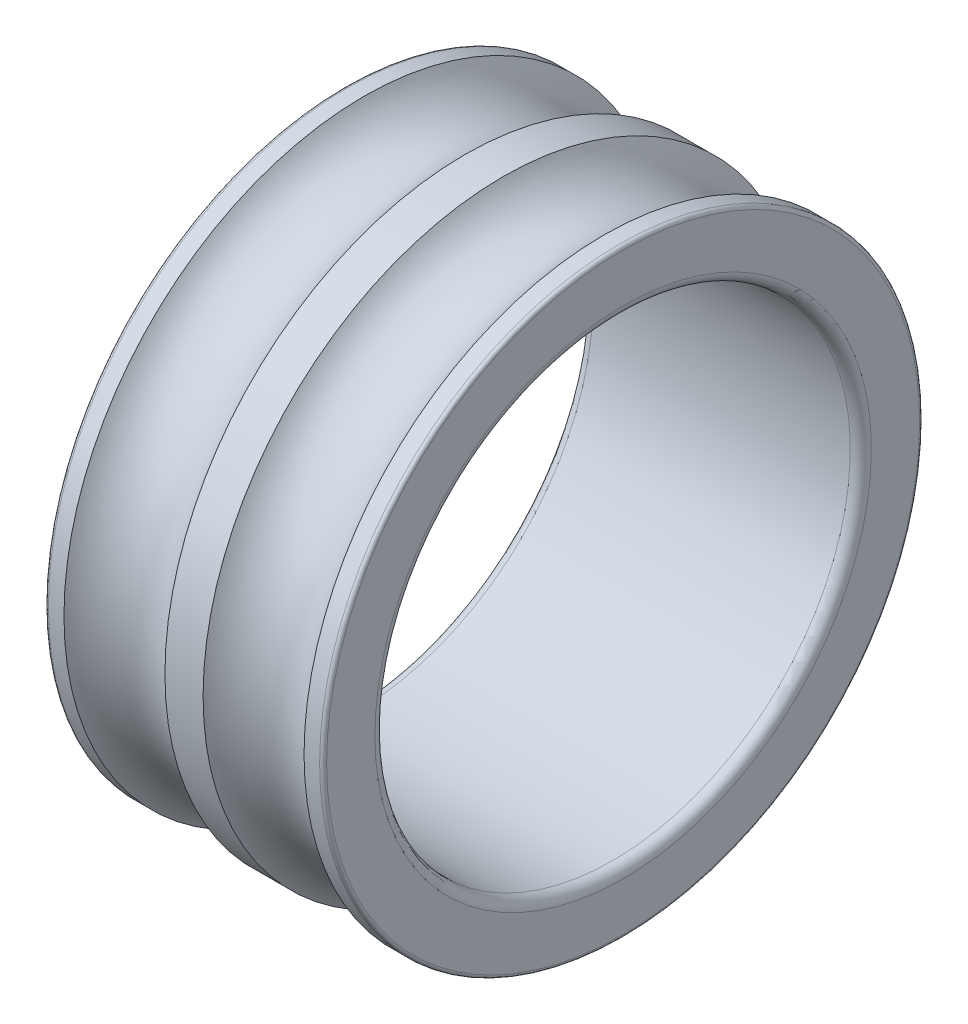
ISO-10303-21;
HEADER;
FILE_DESCRIPTION(('STEP AP214'),'2;1');
FILE_NAME('part.step','',(''),(''),'','','');
FILE_SCHEMA(('AUTOMOTIVE_DESIGN { 1 0 10303 214 1 1 1 1 }'));
ENDSEC;
DATA;
#1=APPLICATION_CONTEXT('core data for automotive mechanical design processes');
#2=APPLICATION_PROTOCOL_DEFINITION('international standard','automotive_design',2000,#1);
#3=PRODUCT_CONTEXT('',#1,'mechanical');
#4=PRODUCT('Part','Part','',(#3));
#5=PRODUCT_RELATED_PRODUCT_CATEGORY('part','',(#4));
#6=PRODUCT_DEFINITION_FORMATION('','',#4);
#7=PRODUCT_DEFINITION_CONTEXT('part definition',#1,'design');
#8=PRODUCT_DEFINITION('design','',#6,#7);
#9=PRODUCT_DEFINITION_SHAPE('','',#8);
#10=(LENGTH_UNIT() NAMED_UNIT(*) SI_UNIT(.MILLI.,.METRE.));
#11=(NAMED_UNIT(*) PLANE_ANGLE_UNIT() SI_UNIT($,.RADIAN.));
#12=(NAMED_UNIT(*) SI_UNIT($,.STERADIAN.) SOLID_ANGLE_UNIT());
#13=UNCERTAINTY_MEASURE_WITH_UNIT(LENGTH_MEASURE(1.E-05),#10,'distance_accuracy_value','');
#14=(GEOMETRIC_REPRESENTATION_CONTEXT(3) GLOBAL_UNCERTAINTY_ASSIGNED_CONTEXT((#13)) GLOBAL_UNIT_ASSIGNED_CONTEXT((#10,
#11,#12)) REPRESENTATION_CONTEXT('',''));
#15=CARTESIAN_POINT('',(0.,0.,0.));
#16=DIRECTION('',(0.,0.,1.));
#17=DIRECTION('',(1.,0.,0.));
#18=AXIS2_PLACEMENT_3D('',#15,#16,#17);
#19=CARTESIAN_POINT('',(2.09999999999957,0.,0.));
#20=DIRECTION('',(-1.,0.,0.));
#21=DIRECTION('',(0.,0.,1.));
#22=AXIS2_PLACEMENT_3D('',#19,#20,#21);
#23=TOROIDAL_SURFACE('',#22,49.5999999999996,2.09999999999957);
#24=CARTESIAN_POINT('',(2.1,0.,0.));
#25=DIRECTION('',(-1.,0.,0.));
#26=DIRECTION('',(0.,0.,1.));
#27=AXIS2_PLACEMENT_3D('',#24,#25,#26);
#28=CIRCLE('',#27,47.5);
#29=CARTESIAN_POINT('',(2.1,0.,47.5));
#30=VERTEX_POINT('',#29);
#31=EDGE_CURVE('E10',#30,#30,#28,.T.);
#32=ORIENTED_EDGE('',*,*,#31,.F.);
#33=EDGE_LOOP('',(#32));
#34=FACE_BOUND('',#33,.T.);
#35=CARTESIAN_POINT('',(0.,0.,0.));
#36=DIRECTION('',(-1.,0.,0.));
#37=DIRECTION('',(0.,0.,1.));
#38=AXIS2_PLACEMENT_3D('',#35,#36,#37);
#39=CIRCLE('',#38,49.6);
#40=CARTESIAN_POINT('',(0.,0.,49.6));
#41=VERTEX_POINT('',#40);
#42=EDGE_CURVE('E71',#41,#41,#39,.T.);
#43=ORIENTED_EDGE('',*,*,#42,.T.);
#44=EDGE_LOOP('',(#43));
#45=FACE_BOUND('',#44,.T.);
#46=ADVANCED_FACE('F31',(#34,#45),#23,.T.);
#47=CARTESIAN_POINT('',(55.6,0.,0.));
#48=DIRECTION('',(-1.,0.,0.));
#49=DIRECTION('',(0.,0.,1.));
#50=AXIS2_PLACEMENT_3D('',#47,#48,#49);
#51=CYLINDRICAL_SURFACE('',#50,47.5);
#52=CARTESIAN_POINT('',(53.5,0.,0.));
#53=DIRECTION('',(-1.,0.,0.));
#54=DIRECTION('',(0.,0.,1.));
#55=AXIS2_PLACEMENT_3D('',#52,#53,#54);
#56=CIRCLE('',#55,47.5);
#57=CARTESIAN_POINT('',(53.5,0.,47.5));
#58=VERTEX_POINT('',#57);
#59=EDGE_CURVE('E37',#58,#58,#56,.T.);
#60=ORIENTED_EDGE('',*,*,#59,.F.);
#61=EDGE_LOOP('',(#60));
#62=FACE_BOUND('',#61,.T.);
#63=ORIENTED_EDGE('',*,*,#31,.T.);
#64=EDGE_LOOP('',(#63));
#65=FACE_BOUND('',#64,.T.);
#66=ADVANCED_FACE('F132',(#62,#65),#51,.F.);
#67=CARTESIAN_POINT('',(53.5000000000009,0.,0.));
#68=DIRECTION('',(-1.,0.,0.));
#69=DIRECTION('',(0.,0.,1.));
#70=AXIS2_PLACEMENT_3D('',#67,#68,#69);
#71=TOROIDAL_SURFACE('',#70,49.5999999999991,2.09999999999914);
#72=CARTESIAN_POINT('',(55.6,0.,0.));
#73=DIRECTION('',(-1.,0.,0.));
#74=DIRECTION('',(0.,0.,1.));
#75=AXIS2_PLACEMENT_3D('',#72,#73,#74);
#76=CIRCLE('',#75,49.6);
#77=CARTESIAN_POINT('',(55.6,0.,49.6));
#78=VERTEX_POINT('',#77);
#79=EDGE_CURVE('E41',#78,#78,#76,.T.);
#80=ORIENTED_EDGE('',*,*,#79,.F.);
#81=EDGE_LOOP('',(#80));
#82=FACE_BOUND('',#81,.T.);
#83=ORIENTED_EDGE('',*,*,#59,.T.);
#84=EDGE_LOOP('',(#83));
#85=FACE_BOUND('',#84,.T.);
#86=ADVANCED_FACE('F127',(#82,#85),#71,.T.);
#87=CARTESIAN_POINT('',(55.6,49.6,0.));
#88=DIRECTION('',(-1.,0.,0.));
#89=DIRECTION('',(0.,0.,1.));
#90=AXIS2_PLACEMENT_3D('',#87,#88,#89);
#91=PLANE('',#90);
#92=CARTESIAN_POINT('',(55.6,0.,0.));
#93=DIRECTION('',(-1.,0.,0.));
#94=DIRECTION('',(0.,0.,1.));
#95=AXIS2_PLACEMENT_3D('',#92,#93,#94);
#96=CIRCLE('',#95,59.25);
#97=CARTESIAN_POINT('',(55.6,0.,59.25));
#98=VERTEX_POINT('',#97);
#99=EDGE_CURVE('E45',#98,#98,#96,.T.);
#100=ORIENTED_EDGE('',*,*,#99,.F.);
#101=EDGE_LOOP('',(#100));
#102=FACE_BOUND('',#101,.T.);
#103=ORIENTED_EDGE('',*,*,#79,.T.);
#104=EDGE_LOOP('',(#103));
#105=FACE_BOUND('',#104,.T.);
#106=ADVANCED_FACE('F121',(#102,#105),#91,.F.);
#107=CARTESIAN_POINT('',(54.9000000000014,0.,0.));
#108=DIRECTION('',(-1.,0.,0.));
#109=DIRECTION('',(0.,0.,1.));
#110=AXIS2_PLACEMENT_3D('',#107,#108,#109);
#111=TOROIDAL_SURFACE('',#110,59.2500000000014,0.69999999999858);
#112=CARTESIAN_POINT('',(54.9,0.,0.));
#113=DIRECTION('',(-1.,0.,0.));
#114=DIRECTION('',(0.,0.,1.));
#115=AXIS2_PLACEMENT_3D('',#112,#113,#114);
#116=CIRCLE('',#115,59.95);
#117=CARTESIAN_POINT('',(54.9,0.,59.95));
#118=VERTEX_POINT('',#117);
#119=EDGE_CURVE('E50',#118,#118,#116,.T.);
#120=ORIENTED_EDGE('',*,*,#119,.F.);
#121=EDGE_LOOP('',(#120));
#122=FACE_BOUND('',#121,.T.);
#123=ORIENTED_EDGE('',*,*,#99,.T.);
#124=EDGE_LOOP('',(#123));
#125=FACE_BOUND('',#124,.T.);
#126=ADVANCED_FACE('F115',(#122,#125),#111,.T.);
#127=CARTESIAN_POINT('',(55.6,0.,0.));
#128=DIRECTION('',(-1.,0.,0.));
#129=DIRECTION('',(0.,0.,1.));
#130=AXIS2_PLACEMENT_3D('',#127,#128,#129);
#131=CYLINDRICAL_SURFACE('',#130,59.95);
#132=CARTESIAN_POINT('',(51.786982254371,0.,0.));
#133=DIRECTION('',(-1.,0.,0.));
#134=DIRECTION('',(0.,0.,1.));
#135=AXIS2_PLACEMENT_3D('',#132,#133,#134);
#136=CIRCLE('',#135,59.95);
#137=CARTESIAN_POINT('',(51.786982254371,0.,59.95));
#138=VERTEX_POINT('',#137);
#139=EDGE_CURVE('E53',#138,#138,#136,.T.);
#140=ORIENTED_EDGE('',*,*,#139,.F.);
#141=EDGE_LOOP('',(#140));
#142=FACE_BOUND('',#141,.T.);
#143=ORIENTED_EDGE('',*,*,#119,.T.);
#144=EDGE_LOOP('',(#143));
#145=FACE_BOUND('',#144,.T.);
#146=ADVANCED_FACE('F109',(#142,#145),#131,.T.);
#147=CARTESIAN_POINT('',(41.7,0.,0.));
#148=DIRECTION('',(-1.,0.,0.));
#149=DIRECTION('',(0.,0.,1.));
#150=AXIS2_PLACEMENT_3D('',#147,#148,#149);
#151=TOROIDAL_SURFACE('',#150,66.2749999999996,11.9059999999996);
#152=CARTESIAN_POINT('',(31.613017745629,0.,0.));
#153=DIRECTION('',(-1.,0.,0.));
#154=DIRECTION('',(0.,0.,1.));
#155=AXIS2_PLACEMENT_3D('',#152,#153,#154);
#156=CIRCLE('',#155,59.95);
#157=CARTESIAN_POINT('',(31.613017745629,0.,59.95));
#158=VERTEX_POINT('',#157);
#159=EDGE_CURVE('E56',#158,#158,#156,.T.);
#160=ORIENTED_EDGE('',*,*,#159,.F.);
#161=EDGE_LOOP('',(#160));
#162=FACE_BOUND('',#161,.T.);
#163=ORIENTED_EDGE('',*,*,#139,.T.);
#164=EDGE_LOOP('',(#163));
#165=FACE_BOUND('',#164,.T.);
#166=ADVANCED_FACE('F103',(#162,#165),#151,.F.);
#167=CARTESIAN_POINT('',(55.6,0.,0.));
#168=DIRECTION('',(-1.,0.,0.));
#169=DIRECTION('',(0.,0.,1.));
#170=AXIS2_PLACEMENT_3D('',#167,#168,#169);
#171=CYLINDRICAL_SURFACE('',#170,59.95);
#172=CARTESIAN_POINT('',(23.986982254371,0.,0.));
#173=DIRECTION('',(-1.,0.,0.));
#174=DIRECTION('',(0.,0.,1.));
#175=AXIS2_PLACEMENT_3D('',#172,#173,#174);
#176=CIRCLE('',#175,59.95);
#177=CARTESIAN_POINT('',(23.986982254371,0.,59.95));
#178=VERTEX_POINT('',#177);
#179=EDGE_CURVE('E59',#178,#178,#176,.T.);
#180=ORIENTED_EDGE('',*,*,#179,.F.);
#181=EDGE_LOOP('',(#180));
#182=FACE_BOUND('',#181,.T.);
#183=ORIENTED_EDGE('',*,*,#159,.T.);
#184=EDGE_LOOP('',(#183));
#185=FACE_BOUND('',#184,.T.);
#186=ADVANCED_FACE('F97',(#182,#185),#171,.T.);
#187=CARTESIAN_POINT('',(13.8999999999999,0.,0.));
#188=DIRECTION('',(-1.,0.,0.));
#189=DIRECTION('',(0.,0.,1.));
#190=AXIS2_PLACEMENT_3D('',#187,#188,#189);
#191=TOROIDAL_SURFACE('',#190,66.2749999999998,11.9059999999998);
#192=CARTESIAN_POINT('',(3.8130177456288,0.,0.));
#193=DIRECTION('',(-1.,0.,0.));
#194=DIRECTION('',(0.,0.,1.));
#195=AXIS2_PLACEMENT_3D('',#192,#193,#194);
#196=CIRCLE('',#195,59.95);
#197=CARTESIAN_POINT('',(3.8130177456288,0.,59.95));
#198=VERTEX_POINT('',#197);
#199=EDGE_CURVE('E62',#198,#198,#196,.T.);
#200=ORIENTED_EDGE('',*,*,#199,.F.);
#201=EDGE_LOOP('',(#200));
#202=FACE_BOUND('',#201,.T.);
#203=ORIENTED_EDGE('',*,*,#179,.T.);
#204=EDGE_LOOP('',(#203));
#205=FACE_BOUND('',#204,.T.);
#206=ADVANCED_FACE('F91',(#202,#205),#191,.F.);
#207=CARTESIAN_POINT('',(55.6,0.,0.));
#208=DIRECTION('',(-1.,0.,0.));
#209=DIRECTION('',(0.,0.,1.));
#210=AXIS2_PLACEMENT_3D('',#207,#208,#209);
#211=CYLINDRICAL_SURFACE('',#210,59.95);
#212=CARTESIAN_POINT('',(0.699999999999999,0.,0.));
#213=DIRECTION('',(-1.,0.,0.));
#214=DIRECTION('',(0.,0.,1.));
#215=AXIS2_PLACEMENT_3D('',#212,#213,#214);
#216=CIRCLE('',#215,59.95);
#217=CARTESIAN_POINT('',(0.699999999999999,0.,59.95));
#218=VERTEX_POINT('',#217);
#219=EDGE_CURVE('E65',#218,#218,#216,.T.);
#220=ORIENTED_EDGE('',*,*,#219,.F.);
#221=EDGE_LOOP('',(#220));
#222=FACE_BOUND('',#221,.T.);
#223=ORIENTED_EDGE('',*,*,#199,.T.);
#224=EDGE_LOOP('',(#223));
#225=FACE_BOUND('',#224,.T.);
#226=ADVANCED_FACE('F85',(#222,#225),#211,.T.);
#227=CARTESIAN_POINT('',(0.699999999999302,0.,0.));
#228=DIRECTION('',(-1.,0.,0.));
#229=DIRECTION('',(0.,0.,1.));
#230=AXIS2_PLACEMENT_3D('',#227,#228,#229);
#231=TOROIDAL_SURFACE('',#230,59.2500000000007,0.699999999999303);
#232=CARTESIAN_POINT('',(0.,0.,0.));
#233=DIRECTION('',(-1.,0.,0.));
#234=DIRECTION('',(0.,0.,1.));
#235=AXIS2_PLACEMENT_3D('',#232,#233,#234);
#236=CIRCLE('',#235,59.25);
#237=CARTESIAN_POINT('',(0.,0.,59.25));
#238=VERTEX_POINT('',#237);
#239=EDGE_CURVE('E68',#238,#238,#236,.T.);
#240=ORIENTED_EDGE('',*,*,#239,.F.);
#241=EDGE_LOOP('',(#240));
#242=FACE_BOUND('',#241,.T.);
#243=ORIENTED_EDGE('',*,*,#219,.T.);
#244=EDGE_LOOP('',(#243));
#245=FACE_BOUND('',#244,.T.);
#246=ADVANCED_FACE('F79',(#242,#245),#231,.T.);
#247=CARTESIAN_POINT('',(0.,59.25,0.));
#248=DIRECTION('',(1.,0.,0.));
#249=DIRECTION('',(0.,0.,-1.));
#250=AXIS2_PLACEMENT_3D('',#247,#248,#249);
#251=PLANE('',#250);
#252=ORIENTED_EDGE('',*,*,#42,.F.);
#253=EDGE_LOOP('',(#252));
#254=FACE_BOUND('',#253,.T.);
#255=ORIENTED_EDGE('',*,*,#239,.T.);
#256=EDGE_LOOP('',(#255));
#257=FACE_BOUND('',#256,.T.);
#258=ADVANCED_FACE('F76',(#254,#257),#251,.F.);
#259=CLOSED_SHELL('',(#46,#66,#86,#106,#126,#146,#166,#186,#206,#226,#246,#258));
#260=MANIFOLD_SOLID_BREP('B2',#259);
#261=ADVANCED_BREP_SHAPE_REPRESENTATION('',(#18,#260),#14);
#262=SHAPE_DEFINITION_REPRESENTATION(#9,#261);
ENDSEC;
END-ISO-10303-21;
